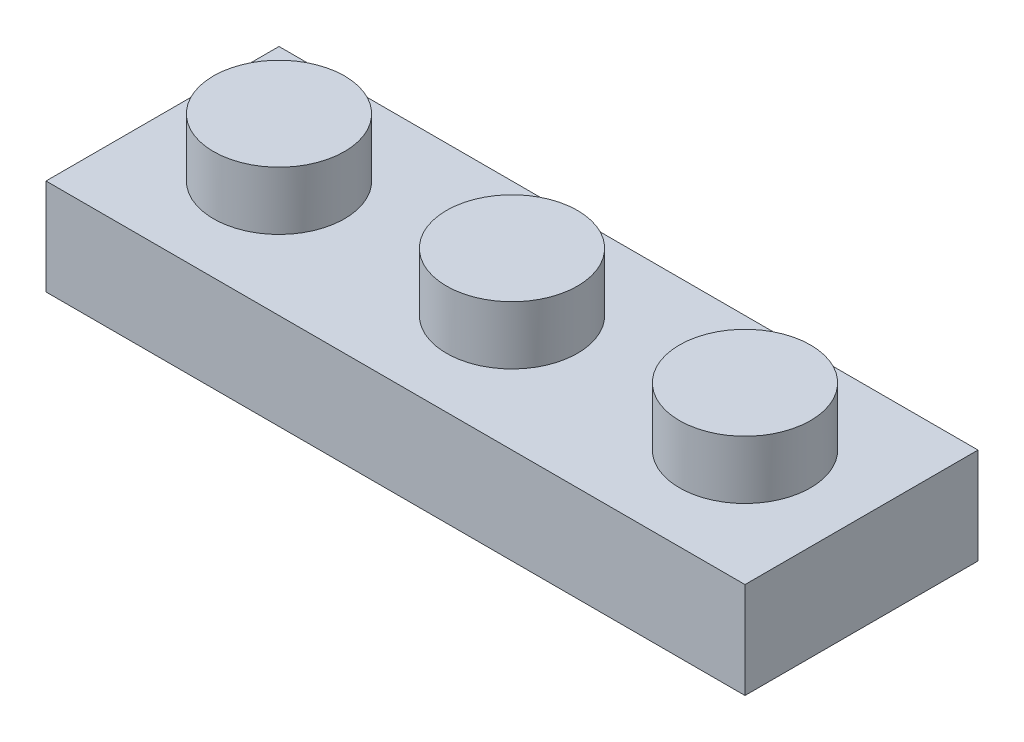
ISO-10303-21;
HEADER;
FILE_DESCRIPTION(('STEP AP214'),'2;1');
FILE_NAME('part.step','',(''),(''),'','','');
FILE_SCHEMA(('AUTOMOTIVE_DESIGN { 1 0 10303 214 1 1 1 1 }'));
ENDSEC;
DATA;
#1=APPLICATION_CONTEXT('core data for automotive mechanical design processes');
#2=APPLICATION_PROTOCOL_DEFINITION('international standard','automotive_design',2000,#1);
#3=PRODUCT_CONTEXT('',#1,'mechanical');
#4=PRODUCT('Part','Part','',(#3));
#5=PRODUCT_RELATED_PRODUCT_CATEGORY('part','',(#4));
#6=PRODUCT_DEFINITION_FORMATION('','',#4);
#7=PRODUCT_DEFINITION_CONTEXT('part definition',#1,'design');
#8=PRODUCT_DEFINITION('design','',#6,#7);
#9=PRODUCT_DEFINITION_SHAPE('','',#8);
#10=(LENGTH_UNIT() NAMED_UNIT(*) SI_UNIT(.MILLI.,.METRE.));
#11=(NAMED_UNIT(*) PLANE_ANGLE_UNIT() SI_UNIT($,.RADIAN.));
#12=(NAMED_UNIT(*) SI_UNIT($,.STERADIAN.) SOLID_ANGLE_UNIT());
#13=UNCERTAINTY_MEASURE_WITH_UNIT(LENGTH_MEASURE(1.E-05),#10,'distance_accuracy_value','');
#14=(GEOMETRIC_REPRESENTATION_CONTEXT(3) GLOBAL_UNCERTAINTY_ASSIGNED_CONTEXT((#13)) GLOBAL_UNIT_ASSIGNED_CONTEXT((#10,
#11,#12)) REPRESENTATION_CONTEXT('',''));
#15=CARTESIAN_POINT('',(0.,0.,0.));
#16=DIRECTION('',(0.,0.,1.));
#17=DIRECTION('',(1.,0.,0.));
#18=AXIS2_PLACEMENT_3D('',#15,#16,#17);
#19=CARTESIAN_POINT('',(0.,3.3,-8.));
#20=DIRECTION('',(0.,-1.,0.));
#21=DIRECTION('',(0.,0.,-1.));
#22=AXIS2_PLACEMENT_3D('',#19,#20,#21);
#23=PLANE('',#22);
#24=CARTESIAN_POINT('',(12.,3.3,-4.));
#25=DIRECTION('',(0.,-1.,0.));
#26=DIRECTION('',(0.,0.,-1.));
#27=AXIS2_PLACEMENT_3D('',#24,#25,#26);
#28=CIRCLE('',#27,2.25);
#29=CARTESIAN_POINT('',(12.,3.3,-6.25));
#30=VERTEX_POINT('',#29);
#31=EDGE_CURVE('E44',#30,#30,#28,.F.);
#32=ORIENTED_EDGE('',*,*,#31,.F.);
#33=EDGE_LOOP('',(#32));
#34=FACE_BOUND('',#33,.T.);
#35=DIRECTION('',(0.,0.,1.));
#36=VECTOR('',#35,1.);
#37=CARTESIAN_POINT('',(0.,3.3,0.));
#38=LINE('',#37,#36);
#39=CARTESIAN_POINT('',(0.,3.3,-8.));
#40=VERTEX_POINT('',#39);
#41=CARTESIAN_POINT('',(0.,3.3,0.));
#42=VERTEX_POINT('',#41);
#43=EDGE_CURVE('E254',#40,#42,#38,.T.);
#44=ORIENTED_EDGE('',*,*,#43,.T.);
#45=DIRECTION('',(1.,0.,0.));
#46=VECTOR('',#45,1.);
#47=CARTESIAN_POINT('',(0.,3.3,0.));
#48=LINE('',#47,#46);
#49=CARTESIAN_POINT('',(24.,3.3,0.));
#50=VERTEX_POINT('',#49);
#51=EDGE_CURVE('E257',#42,#50,#48,.T.);
#52=ORIENTED_EDGE('',*,*,#51,.T.);
#53=DIRECTION('',(0.,0.,-1.));
#54=VECTOR('',#53,1.);
#55=CARTESIAN_POINT('',(24.,3.3,0.));
#56=LINE('',#55,#54);
#57=CARTESIAN_POINT('',(24.,3.3,-8.));
#58=VERTEX_POINT('',#57);
#59=EDGE_CURVE('E260',#50,#58,#56,.T.);
#60=ORIENTED_EDGE('',*,*,#59,.T.);
#61=DIRECTION('',(-1.,0.,0.));
#62=VECTOR('',#61,1.);
#63=CARTESIAN_POINT('',(0.,3.3,-8.));
#64=LINE('',#63,#62);
#65=EDGE_CURVE('E262',#58,#40,#64,.T.);
#66=ORIENTED_EDGE('',*,*,#65,.T.);
#67=EDGE_LOOP('',(#44,#52,#60,#66));
#68=FACE_BOUND('',#67,.T.);
#69=CARTESIAN_POINT('',(4.,3.3,-4.));
#70=DIRECTION('',(0.,-1.,0.));
#71=DIRECTION('',(0.,0.,-1.));
#72=AXIS2_PLACEMENT_3D('',#69,#70,#71);
#73=CIRCLE('',#72,2.25);
#74=CARTESIAN_POINT('',(4.,3.3,-6.25));
#75=VERTEX_POINT('',#74);
#76=EDGE_CURVE('E283',#75,#75,#73,.F.);
#77=ORIENTED_EDGE('',*,*,#76,.F.);
#78=EDGE_LOOP('',(#77));
#79=FACE_BOUND('',#78,.T.);
#80=CARTESIAN_POINT('',(20.,3.3,-4.));
#81=DIRECTION('',(0.,-1.,0.));
#82=DIRECTION('',(0.,0.,-1.));
#83=AXIS2_PLACEMENT_3D('',#80,#81,#82);
#84=CIRCLE('',#83,2.25);
#85=CARTESIAN_POINT('',(20.,3.3,-6.25));
#86=VERTEX_POINT('',#85);
#87=EDGE_CURVE('E11',#86,#86,#84,.F.);
#88=ORIENTED_EDGE('',*,*,#87,.F.);
#89=EDGE_LOOP('',(#88));
#90=FACE_BOUND('',#89,.T.);
#91=ADVANCED_FACE('F36',(#34,#68,#79,#90),#23,.F.);
#92=CARTESIAN_POINT('',(0.,3.3,0.));
#93=DIRECTION('',(1.,0.,0.));
#94=DIRECTION('',(0.,0.,-1.));
#95=AXIS2_PLACEMENT_3D('',#92,#93,#94);
#96=PLANE('',#95);
#97=DIRECTION('',(0.,0.,1.));
#98=VECTOR('',#97,1.);
#99=CARTESIAN_POINT('',(0.,0.,0.));
#100=LINE('',#99,#98);
#101=CARTESIAN_POINT('',(0.,0.,-8.));
#102=VERTEX_POINT('',#101);
#103=CARTESIAN_POINT('',(0.,0.,0.));
#104=VERTEX_POINT('',#103);
#105=EDGE_CURVE('E253',#102,#104,#100,.T.);
#106=ORIENTED_EDGE('',*,*,#105,.T.);
#107=DIRECTION('',(0.,-1.,0.));
#108=VECTOR('',#107,1.);
#109=CARTESIAN_POINT('',(0.,3.3,0.));
#110=LINE('',#109,#108);
#111=EDGE_CURVE('E280',#42,#104,#110,.T.);
#112=ORIENTED_EDGE('',*,*,#111,.F.);
#113=ORIENTED_EDGE('',*,*,#43,.F.);
#114=DIRECTION('',(0.,-1.,0.));
#115=VECTOR('',#114,1.);
#116=CARTESIAN_POINT('',(0.,3.3,-8.));
#117=LINE('',#116,#115);
#118=EDGE_CURVE('E264',#40,#102,#117,.T.);
#119=ORIENTED_EDGE('',*,*,#118,.T.);
#120=EDGE_LOOP('',(#106,#112,#113,#119));
#121=FACE_BOUND('',#120,.T.);
#122=ADVANCED_FACE('F38',(#121),#96,.F.);
#123=CARTESIAN_POINT('',(0.,3.3,0.));
#124=DIRECTION('',(0.,0.,-1.));
#125=DIRECTION('',(-1.,0.,0.));
#126=AXIS2_PLACEMENT_3D('',#123,#124,#125);
#127=PLANE('',#126);
#128=DIRECTION('',(1.,0.,0.));
#129=VECTOR('',#128,1.);
#130=CARTESIAN_POINT('',(0.,0.,0.));
#131=LINE('',#130,#129);
#132=CARTESIAN_POINT('',(24.,0.,0.));
#133=VERTEX_POINT('',#132);
#134=EDGE_CURVE('E267',#104,#133,#131,.T.);
#135=ORIENTED_EDGE('',*,*,#134,.T.);
#136=DIRECTION('',(0.,-1.,0.));
#137=VECTOR('',#136,1.);
#138=CARTESIAN_POINT('',(24.,3.3,0.));
#139=LINE('',#138,#137);
#140=EDGE_CURVE('E277',#50,#133,#139,.T.);
#141=ORIENTED_EDGE('',*,*,#140,.F.);
#142=ORIENTED_EDGE('',*,*,#51,.F.);
#143=ORIENTED_EDGE('',*,*,#111,.T.);
#144=EDGE_LOOP('',(#135,#141,#142,#143));
#145=FACE_BOUND('',#144,.T.);
#146=ADVANCED_FACE('F389',(#145),#127,.F.);
#147=CARTESIAN_POINT('',(24.,3.3,0.));
#148=DIRECTION('',(-1.,0.,0.));
#149=DIRECTION('',(0.,0.,1.));
#150=AXIS2_PLACEMENT_3D('',#147,#148,#149);
#151=PLANE('',#150);
#152=DIRECTION('',(0.,0.,-1.));
#153=VECTOR('',#152,1.);
#154=CARTESIAN_POINT('',(24.,0.,0.));
#155=LINE('',#154,#153);
#156=CARTESIAN_POINT('',(24.,0.,-8.));
#157=VERTEX_POINT('',#156);
#158=EDGE_CURVE('E269',#133,#157,#155,.T.);
#159=ORIENTED_EDGE('',*,*,#158,.T.);
#160=DIRECTION('',(0.,-1.,0.));
#161=VECTOR('',#160,1.);
#162=CARTESIAN_POINT('',(24.,3.3,-8.));
#163=LINE('',#162,#161);
#164=EDGE_CURVE('E274',#58,#157,#163,.T.);
#165=ORIENTED_EDGE('',*,*,#164,.F.);
#166=ORIENTED_EDGE('',*,*,#59,.F.);
#167=ORIENTED_EDGE('',*,*,#140,.T.);
#168=EDGE_LOOP('',(#159,#165,#166,#167));
#169=FACE_BOUND('',#168,.T.);
#170=ADVANCED_FACE('F386',(#169),#151,.F.);
#171=CARTESIAN_POINT('',(0.,3.3,-8.));
#172=DIRECTION('',(0.,0.,1.));
#173=DIRECTION('',(1.,0.,0.));
#174=AXIS2_PLACEMENT_3D('',#171,#172,#173);
#175=PLANE('',#174);
#176=DIRECTION('',(-1.,0.,0.));
#177=VECTOR('',#176,1.);
#178=CARTESIAN_POINT('',(0.,0.,-8.));
#179=LINE('',#178,#177);
#180=EDGE_CURVE('E258',#157,#102,#179,.T.);
#181=ORIENTED_EDGE('',*,*,#180,.T.);
#182=ORIENTED_EDGE('',*,*,#118,.F.);
#183=ORIENTED_EDGE('',*,*,#65,.F.);
#184=ORIENTED_EDGE('',*,*,#164,.T.);
#185=EDGE_LOOP('',(#181,#182,#183,#184));
#186=FACE_BOUND('',#185,.T.);
#187=ADVANCED_FACE('F367',(#186),#175,.F.);
#188=CARTESIAN_POINT('',(0.,0.,-8.));
#189=DIRECTION('',(0.,-1.,0.));
#190=DIRECTION('',(0.,0.,-1.));
#191=AXIS2_PLACEMENT_3D('',#188,#189,#190);
#192=PLANE('',#191);
#193=DIRECTION('',(0.,0.,-1.));
#194=VECTOR('',#193,1.);
#195=CARTESIAN_POINT('',(1.75,0.,-1.75));
#196=LINE('',#195,#194);
#197=CARTESIAN_POINT('',(1.75,0.,-1.75));
#198=VERTEX_POINT('',#197);
#199=CARTESIAN_POINT('',(1.74999999999999,0.,-6.25));
#200=VERTEX_POINT('',#199);
#201=EDGE_CURVE('E51',#198,#200,#196,.T.);
#202=ORIENTED_EDGE('',*,*,#201,.F.);
#203=DIRECTION('',(-1.,0.,0.));
#204=VECTOR('',#203,1.);
#205=CARTESIAN_POINT('',(1.75,0.,-1.75));
#206=LINE('',#205,#204);
#207=CARTESIAN_POINT('',(6.25,0.,-1.75));
#208=VERTEX_POINT('',#207);
#209=EDGE_CURVE('E181',#208,#198,#206,.T.);
#210=ORIENTED_EDGE('',*,*,#209,.F.);
#211=DIRECTION('',(0.,0.,1.));
#212=VECTOR('',#211,1.);
#213=CARTESIAN_POINT('',(6.25,0.,-1.75));
#214=LINE('',#213,#212);
#215=CARTESIAN_POINT('',(6.25,0.,-6.25));
#216=VERTEX_POINT('',#215);
#217=EDGE_CURVE('E172',#216,#208,#214,.T.);
#218=ORIENTED_EDGE('',*,*,#217,.F.);
#219=DIRECTION('',(1.,0.,0.));
#220=VECTOR('',#219,1.);
#221=CARTESIAN_POINT('',(1.74999999999999,0.,-6.25));
#222=LINE('',#221,#220);
#223=EDGE_CURVE('E160',#200,#216,#222,.T.);
#224=ORIENTED_EDGE('',*,*,#223,.F.);
#225=EDGE_LOOP('',(#202,#210,#218,#224));
#226=FACE_BOUND('',#225,.T.);
#227=DIRECTION('',(0.,0.,-1.));
#228=VECTOR('',#227,1.);
#229=CARTESIAN_POINT('',(9.75,0.,-1.75));
#230=LINE('',#229,#228);
#231=CARTESIAN_POINT('',(9.75,0.,-1.75));
#232=VERTEX_POINT('',#231);
#233=CARTESIAN_POINT('',(9.74999999999999,0.,-6.25));
#234=VERTEX_POINT('',#233);
#235=EDGE_CURVE('E59',#232,#234,#230,.T.);
#236=ORIENTED_EDGE('',*,*,#235,.F.);
#237=DIRECTION('',(-1.,0.,0.));
#238=VECTOR('',#237,1.);
#239=CARTESIAN_POINT('',(9.75,0.,-1.75));
#240=LINE('',#239,#238);
#241=CARTESIAN_POINT('',(14.25,0.,-1.75));
#242=VERTEX_POINT('',#241);
#243=EDGE_CURVE('E207',#242,#232,#240,.T.);
#244=ORIENTED_EDGE('',*,*,#243,.F.);
#245=DIRECTION('',(0.,0.,1.));
#246=VECTOR('',#245,1.);
#247=CARTESIAN_POINT('',(14.25,0.,-1.75));
#248=LINE('',#247,#246);
#249=CARTESIAN_POINT('',(14.25,0.,-6.25));
#250=VERTEX_POINT('',#249);
#251=EDGE_CURVE('E202',#250,#242,#248,.T.);
#252=ORIENTED_EDGE('',*,*,#251,.F.);
#253=DIRECTION('',(1.,0.,0.));
#254=VECTOR('',#253,1.);
#255=CARTESIAN_POINT('',(9.74999999999999,0.,-6.25));
#256=LINE('',#255,#254);
#257=EDGE_CURVE('E186',#234,#250,#256,.T.);
#258=ORIENTED_EDGE('',*,*,#257,.F.);
#259=EDGE_LOOP('',(#236,#244,#252,#258));
#260=FACE_BOUND('',#259,.T.);
#261=DIRECTION('',(0.,0.,-1.));
#262=VECTOR('',#261,1.);
#263=CARTESIAN_POINT('',(17.75,0.,-1.75));
#264=LINE('',#263,#262);
#265=CARTESIAN_POINT('',(17.75,0.,-1.75));
#266=VERTEX_POINT('',#265);
#267=CARTESIAN_POINT('',(17.75,0.,-6.25));
#268=VERTEX_POINT('',#267);
#269=EDGE_CURVE('E218',#266,#268,#264,.T.);
#270=ORIENTED_EDGE('',*,*,#269,.F.);
#271=DIRECTION('',(-1.,0.,0.));
#272=VECTOR('',#271,1.);
#273=CARTESIAN_POINT('',(17.75,0.,-1.75));
#274=LINE('',#273,#272);
#275=CARTESIAN_POINT('',(22.25,0.,-1.75));
#276=VERTEX_POINT('',#275);
#277=EDGE_CURVE('E223',#276,#266,#274,.T.);
#278=ORIENTED_EDGE('',*,*,#277,.F.);
#279=DIRECTION('',(0.,0.,1.));
#280=VECTOR('',#279,1.);
#281=CARTESIAN_POINT('',(22.25,0.,-1.75));
#282=LINE('',#281,#280);
#283=CARTESIAN_POINT('',(22.25,0.,-6.25));
#284=VERTEX_POINT('',#283);
#285=EDGE_CURVE('E237',#284,#276,#282,.T.);
#286=ORIENTED_EDGE('',*,*,#285,.F.);
#287=DIRECTION('',(1.,0.,0.));
#288=VECTOR('',#287,1.);
#289=CARTESIAN_POINT('',(17.75,0.,-6.25));
#290=LINE('',#289,#288);
#291=EDGE_CURVE('E234',#268,#284,#290,.T.);
#292=ORIENTED_EDGE('',*,*,#291,.F.);
#293=EDGE_LOOP('',(#270,#278,#286,#292));
#294=FACE_BOUND('',#293,.T.);
#295=ORIENTED_EDGE('',*,*,#105,.F.);
#296=ORIENTED_EDGE('',*,*,#180,.F.);
#297=ORIENTED_EDGE('',*,*,#158,.F.);
#298=ORIENTED_EDGE('',*,*,#134,.F.);
#299=EDGE_LOOP('',(#295,#296,#297,#298));
#300=FACE_BOUND('',#299,.T.);
#301=ADVANCED_FACE('F361',(#226,#260,#294,#300),#192,.T.);
#302=CARTESIAN_POINT('',(4.,5.3,-4.));
#303=DIRECTION('',(0.,-1.,0.));
#304=DIRECTION('',(0.,0.,-1.));
#305=AXIS2_PLACEMENT_3D('',#302,#303,#304);
#306=CYLINDRICAL_SURFACE('',#305,2.25);
#307=CARTESIAN_POINT('',(4.,5.3,-4.));
#308=DIRECTION('',(0.,1.,0.));
#309=DIRECTION('',(0.,0.,1.));
#310=AXIS2_PLACEMENT_3D('',#307,#308,#309);
#311=CIRCLE('',#310,2.25);
#312=CARTESIAN_POINT('',(4.,5.3,-1.75));
#313=VERTEX_POINT('',#312);
#314=EDGE_CURVE('E244',#313,#313,#311,.T.);
#315=ORIENTED_EDGE('',*,*,#314,.F.);
#316=EDGE_LOOP('',(#315));
#317=FACE_BOUND('',#316,.T.);
#318=ORIENTED_EDGE('',*,*,#76,.T.);
#319=EDGE_LOOP('',(#318));
#320=FACE_BOUND('',#319,.T.);
#321=ADVANCED_FACE('F366',(#317,#320),#306,.T.);
#322=CARTESIAN_POINT('',(4.,5.3,-4.));
#323=DIRECTION('',(0.,1.,0.));
#324=DIRECTION('',(0.,0.,1.));
#325=AXIS2_PLACEMENT_3D('',#322,#323,#324);
#326=PLANE('',#325);
#327=ORIENTED_EDGE('',*,*,#314,.T.);
#328=EDGE_LOOP('',(#327));
#329=FACE_BOUND('',#328,.T.);
#330=ADVANCED_FACE('F401',(#329),#326,.T.);
#331=CARTESIAN_POINT('',(17.75,2.5,-1.75));
#332=DIRECTION('',(-1.,0.,0.));
#333=DIRECTION('',(0.,0.,1.));
#334=AXIS2_PLACEMENT_3D('',#331,#332,#333);
#335=PLANE('',#334);
#336=ORIENTED_EDGE('',*,*,#269,.T.);
#337=DIRECTION('',(0.,-1.,0.));
#338=VECTOR('',#337,1.);
#339=CARTESIAN_POINT('',(17.75,2.5,-6.25));
#340=LINE('',#339,#338);
#341=CARTESIAN_POINT('',(17.75,2.5,-6.25));
#342=VERTEX_POINT('',#341);
#343=EDGE_CURVE('E232',#342,#268,#340,.T.);
#344=ORIENTED_EDGE('',*,*,#343,.F.);
#345=DIRECTION('',(0.,0.,-1.));
#346=VECTOR('',#345,1.);
#347=CARTESIAN_POINT('',(17.75,2.5,-1.75));
#348=LINE('',#347,#346);
#349=CARTESIAN_POINT('',(17.75,2.5,-1.75));
#350=VERTEX_POINT('',#349);
#351=EDGE_CURVE('E219',#350,#342,#348,.T.);
#352=ORIENTED_EDGE('',*,*,#351,.F.);
#353=DIRECTION('',(0.,-1.,0.));
#354=VECTOR('',#353,1.);
#355=CARTESIAN_POINT('',(17.75,2.5,-1.75));
#356=LINE('',#355,#354);
#357=EDGE_CURVE('E242',#350,#266,#356,.T.);
#358=ORIENTED_EDGE('',*,*,#357,.T.);
#359=EDGE_LOOP('',(#336,#344,#352,#358));
#360=FACE_BOUND('',#359,.T.);
#361=ADVANCED_FACE('F405',(#360),#335,.F.);
#362=CARTESIAN_POINT('',(17.75,2.5,-1.75));
#363=DIRECTION('',(0.,0.,1.));
#364=DIRECTION('',(1.,0.,0.));
#365=AXIS2_PLACEMENT_3D('',#362,#363,#364);
#366=PLANE('',#365);
#367=ORIENTED_EDGE('',*,*,#277,.T.);
#368=ORIENTED_EDGE('',*,*,#357,.F.);
#369=DIRECTION('',(-1.,0.,0.));
#370=VECTOR('',#369,1.);
#371=CARTESIAN_POINT('',(17.75,2.5,-1.75));
#372=LINE('',#371,#370);
#373=CARTESIAN_POINT('',(22.25,2.5,-1.75));
#374=VERTEX_POINT('',#373);
#375=EDGE_CURVE('E229',#374,#350,#372,.T.);
#376=ORIENTED_EDGE('',*,*,#375,.F.);
#377=DIRECTION('',(0.,-1.,0.));
#378=VECTOR('',#377,1.);
#379=CARTESIAN_POINT('',(22.25,2.5,-1.75));
#380=LINE('',#379,#378);
#381=EDGE_CURVE('E245',#374,#276,#380,.T.);
#382=ORIENTED_EDGE('',*,*,#381,.T.);
#383=EDGE_LOOP('',(#367,#368,#376,#382));
#384=FACE_BOUND('',#383,.T.);
#385=ADVANCED_FACE('F409',(#384),#366,.F.);
#386=CARTESIAN_POINT('',(22.25,2.5,-1.75));
#387=DIRECTION('',(1.,0.,0.));
#388=DIRECTION('',(0.,0.,-1.));
#389=AXIS2_PLACEMENT_3D('',#386,#387,#388);
#390=PLANE('',#389);
#391=ORIENTED_EDGE('',*,*,#285,.T.);
#392=ORIENTED_EDGE('',*,*,#381,.F.);
#393=DIRECTION('',(0.,0.,1.));
#394=VECTOR('',#393,1.);
#395=CARTESIAN_POINT('',(22.25,2.5,-1.75));
#396=LINE('',#395,#394);
#397=CARTESIAN_POINT('',(22.25,2.5,-6.25));
#398=VERTEX_POINT('',#397);
#399=EDGE_CURVE('E226',#398,#374,#396,.T.);
#400=ORIENTED_EDGE('',*,*,#399,.F.);
#401=DIRECTION('',(0.,-1.,0.));
#402=VECTOR('',#401,1.);
#403=CARTESIAN_POINT('',(22.25,2.5,-6.25));
#404=LINE('',#403,#402);
#405=EDGE_CURVE('E247',#398,#284,#404,.T.);
#406=ORIENTED_EDGE('',*,*,#405,.T.);
#407=EDGE_LOOP('',(#391,#392,#400,#406));
#408=FACE_BOUND('',#407,.T.);
#409=ADVANCED_FACE('F414',(#408),#390,.F.);
#410=CARTESIAN_POINT('',(17.75,2.5,-6.25));
#411=DIRECTION('',(0.,0.,-1.));
#412=DIRECTION('',(-1.,0.,0.));
#413=AXIS2_PLACEMENT_3D('',#410,#411,#412);
#414=PLANE('',#413);
#415=ORIENTED_EDGE('',*,*,#291,.T.);
#416=ORIENTED_EDGE('',*,*,#405,.F.);
#417=DIRECTION('',(1.,0.,0.));
#418=VECTOR('',#417,1.);
#419=CARTESIAN_POINT('',(17.75,2.5,-6.25));
#420=LINE('',#419,#418);
#421=EDGE_CURVE('E222',#342,#398,#420,.T.);
#422=ORIENTED_EDGE('',*,*,#421,.F.);
#423=ORIENTED_EDGE('',*,*,#343,.T.);
#424=EDGE_LOOP('',(#415,#416,#422,#423));
#425=FACE_BOUND('',#424,.T.);
#426=ADVANCED_FACE('F411',(#425),#414,.F.);
#427=CARTESIAN_POINT('',(17.75,2.5,-6.25));
#428=DIRECTION('',(0.,-1.,0.));
#429=DIRECTION('',(0.,0.,-1.));
#430=AXIS2_PLACEMENT_3D('',#427,#428,#429);
#431=PLANE('',#430);
#432=ORIENTED_EDGE('',*,*,#351,.T.);
#433=ORIENTED_EDGE('',*,*,#421,.T.);
#434=ORIENTED_EDGE('',*,*,#399,.T.);
#435=ORIENTED_EDGE('',*,*,#375,.T.);
#436=EDGE_LOOP('',(#432,#433,#434,#435));
#437=FACE_BOUND('',#436,.T.);
#438=ADVANCED_FACE('F316',(#437),#431,.T.);
#439=CARTESIAN_POINT('',(12.,5.3,-4.));
#440=DIRECTION('',(0.,-1.,0.));
#441=DIRECTION('',(0.,0.,-1.));
#442=AXIS2_PLACEMENT_3D('',#439,#440,#441);
#443=CYLINDRICAL_SURFACE('',#442,2.25);
#444=CARTESIAN_POINT('',(12.,5.3,-4.));
#445=DIRECTION('',(0.,1.,0.));
#446=DIRECTION('',(0.,0.,1.));
#447=AXIS2_PLACEMENT_3D('',#444,#445,#446);
#448=CIRCLE('',#447,2.25);
#449=CARTESIAN_POINT('',(12.,5.3,-1.75));
#450=VERTEX_POINT('',#449);
#451=EDGE_CURVE('E215',#450,#450,#448,.T.);
#452=ORIENTED_EDGE('',*,*,#451,.F.);
#453=EDGE_LOOP('',(#452));
#454=FACE_BOUND('',#453,.T.);
#455=ORIENTED_EDGE('',*,*,#31,.T.);
#456=EDGE_LOOP('',(#455));
#457=FACE_BOUND('',#456,.T.);
#458=ADVANCED_FACE('F288',(#454,#457),#443,.T.);
#459=CARTESIAN_POINT('',(12.,5.3,-4.));
#460=DIRECTION('',(0.,1.,0.));
#461=DIRECTION('',(0.,0.,1.));
#462=AXIS2_PLACEMENT_3D('',#459,#460,#461);
#463=PLANE('',#462);
#464=ORIENTED_EDGE('',*,*,#451,.T.);
#465=EDGE_LOOP('',(#464));
#466=FACE_BOUND('',#465,.T.);
#467=ADVANCED_FACE('F303',(#466),#463,.T.);
#468=CARTESIAN_POINT('',(20.,5.3,-4.));
#469=DIRECTION('',(0.,-1.,0.));
#470=DIRECTION('',(0.,0.,-1.));
#471=AXIS2_PLACEMENT_3D('',#468,#469,#470);
#472=CYLINDRICAL_SURFACE('',#471,2.25);
#473=CARTESIAN_POINT('',(20.,5.3,-4.));
#474=DIRECTION('',(0.,1.,0.));
#475=DIRECTION('',(0.,0.,1.));
#476=AXIS2_PLACEMENT_3D('',#473,#474,#475);
#477=CIRCLE('',#476,2.25);
#478=CARTESIAN_POINT('',(20.,5.3,-1.75));
#479=VERTEX_POINT('',#478);
#480=EDGE_CURVE('E212',#479,#479,#477,.T.);
#481=ORIENTED_EDGE('',*,*,#480,.F.);
#482=EDGE_LOOP('',(#481));
#483=FACE_BOUND('',#482,.T.);
#484=ORIENTED_EDGE('',*,*,#87,.T.);
#485=EDGE_LOOP('',(#484));
#486=FACE_BOUND('',#485,.T.);
#487=ADVANCED_FACE('F300',(#483,#486),#472,.T.);
#488=CARTESIAN_POINT('',(20.,5.3,-4.));
#489=DIRECTION('',(0.,1.,0.));
#490=DIRECTION('',(0.,0.,1.));
#491=AXIS2_PLACEMENT_3D('',#488,#489,#490);
#492=PLANE('',#491);
#493=ORIENTED_EDGE('',*,*,#480,.T.);
#494=EDGE_LOOP('',(#493));
#495=FACE_BOUND('',#494,.T.);
#496=ADVANCED_FACE('F302',(#495),#492,.T.);
#497=CARTESIAN_POINT('',(9.75,2.5,-1.75));
#498=DIRECTION('',(-1.,0.,0.));
#499=DIRECTION('',(0.,0.,1.));
#500=AXIS2_PLACEMENT_3D('',#497,#498,#499);
#501=PLANE('',#500);
#502=ORIENTED_EDGE('',*,*,#235,.T.);
#503=DIRECTION('',(0.,-1.,0.));
#504=VECTOR('',#503,1.);
#505=CARTESIAN_POINT('',(9.74999999999999,2.5,-6.25));
#506=LINE('',#505,#504);
#507=CARTESIAN_POINT('',(9.74999999999999,2.5,-6.25));
#508=VERTEX_POINT('',#507);
#509=EDGE_CURVE('E200',#508,#234,#506,.T.);
#510=ORIENTED_EDGE('',*,*,#509,.F.);
#511=DIRECTION('',(0.,0.,-1.));
#512=VECTOR('',#511,1.);
#513=CARTESIAN_POINT('',(9.75,2.5,-1.75));
#514=LINE('',#513,#512);
#515=CARTESIAN_POINT('',(9.75,2.5,-1.75));
#516=VERTEX_POINT('',#515);
#517=EDGE_CURVE('E188',#516,#508,#514,.T.);
#518=ORIENTED_EDGE('',*,*,#517,.F.);
#519=DIRECTION('',(0.,-1.,0.));
#520=VECTOR('',#519,1.);
#521=CARTESIAN_POINT('',(9.75,2.5,-1.75));
#522=LINE('',#521,#520);
#523=EDGE_CURVE('E209',#516,#232,#522,.T.);
#524=ORIENTED_EDGE('',*,*,#523,.T.);
#525=EDGE_LOOP('',(#502,#510,#518,#524));
#526=FACE_BOUND('',#525,.T.);
#527=ADVANCED_FACE('F311',(#526),#501,.F.);
#528=CARTESIAN_POINT('',(9.75,2.5,-1.75));
#529=DIRECTION('',(0.,0.,1.));
#530=DIRECTION('',(1.,0.,0.));
#531=AXIS2_PLACEMENT_3D('',#528,#529,#530);
#532=PLANE('',#531);
#533=ORIENTED_EDGE('',*,*,#243,.T.);
#534=ORIENTED_EDGE('',*,*,#523,.F.);
#535=DIRECTION('',(-1.,0.,0.));
#536=VECTOR('',#535,1.);
#537=CARTESIAN_POINT('',(9.75,2.5,-1.75));
#538=LINE('',#537,#536);
#539=CARTESIAN_POINT('',(14.25,2.5,-1.75));
#540=VERTEX_POINT('',#539);
#541=EDGE_CURVE('E194',#540,#516,#538,.T.);
#542=ORIENTED_EDGE('',*,*,#541,.F.);
#543=DIRECTION('',(0.,-1.,0.));
#544=VECTOR('',#543,1.);
#545=CARTESIAN_POINT('',(14.25,2.5,-1.75));
#546=LINE('',#545,#544);
#547=EDGE_CURVE('E204',#540,#242,#546,.T.);
#548=ORIENTED_EDGE('',*,*,#547,.T.);
#549=EDGE_LOOP('',(#533,#534,#542,#548));
#550=FACE_BOUND('',#549,.T.);
#551=ADVANCED_FACE('F335',(#550),#532,.F.);
#552=CARTESIAN_POINT('',(14.25,2.5,-1.75));
#553=DIRECTION('',(1.,0.,0.));
#554=DIRECTION('',(0.,0.,-1.));
#555=AXIS2_PLACEMENT_3D('',#552,#553,#554);
#556=PLANE('',#555);
#557=ORIENTED_EDGE('',*,*,#251,.T.);
#558=ORIENTED_EDGE('',*,*,#547,.F.);
#559=DIRECTION('',(0.,0.,1.));
#560=VECTOR('',#559,1.);
#561=CARTESIAN_POINT('',(14.25,2.5,-1.75));
#562=LINE('',#561,#560);
#563=CARTESIAN_POINT('',(14.25,2.5,-6.25));
#564=VERTEX_POINT('',#563);
#565=EDGE_CURVE('E192',#564,#540,#562,.T.);
#566=ORIENTED_EDGE('',*,*,#565,.F.);
#567=DIRECTION('',(0.,-1.,0.));
#568=VECTOR('',#567,1.);
#569=CARTESIAN_POINT('',(14.25,2.5,-6.25));
#570=LINE('',#569,#568);
#571=EDGE_CURVE('E197',#564,#250,#570,.T.);
#572=ORIENTED_EDGE('',*,*,#571,.T.);
#573=EDGE_LOOP('',(#557,#558,#566,#572));
#574=FACE_BOUND('',#573,.T.);
#575=ADVANCED_FACE('F328',(#574),#556,.F.);
#576=CARTESIAN_POINT('',(9.74999999999999,2.5,-6.25));
#577=DIRECTION('',(0.,0.,-1.));
#578=DIRECTION('',(-1.,0.,0.));
#579=AXIS2_PLACEMENT_3D('',#576,#577,#578);
#580=PLANE('',#579);
#581=ORIENTED_EDGE('',*,*,#257,.T.);
#582=ORIENTED_EDGE('',*,*,#571,.F.);
#583=DIRECTION('',(1.,0.,0.));
#584=VECTOR('',#583,1.);
#585=CARTESIAN_POINT('',(9.74999999999999,2.5,-6.25));
#586=LINE('',#585,#584);
#587=EDGE_CURVE('E190',#508,#564,#586,.T.);
#588=ORIENTED_EDGE('',*,*,#587,.F.);
#589=ORIENTED_EDGE('',*,*,#509,.T.);
#590=EDGE_LOOP('',(#581,#582,#588,#589));
#591=FACE_BOUND('',#590,.T.);
#592=ADVANCED_FACE('F319',(#591),#580,.F.);
#593=CARTESIAN_POINT('',(9.74999999999999,2.5,-6.25));
#594=DIRECTION('',(0.,-1.,0.));
#595=DIRECTION('',(0.,0.,-1.));
#596=AXIS2_PLACEMENT_3D('',#593,#594,#595);
#597=PLANE('',#596);
#598=ORIENTED_EDGE('',*,*,#517,.T.);
#599=ORIENTED_EDGE('',*,*,#587,.T.);
#600=ORIENTED_EDGE('',*,*,#565,.T.);
#601=ORIENTED_EDGE('',*,*,#541,.T.);
#602=EDGE_LOOP('',(#598,#599,#600,#601));
#603=FACE_BOUND('',#602,.T.);
#604=ADVANCED_FACE('F306',(#603),#597,.T.);
#605=CARTESIAN_POINT('',(1.75,2.5,-1.75));
#606=DIRECTION('',(-1.,0.,0.));
#607=DIRECTION('',(0.,0.,1.));
#608=AXIS2_PLACEMENT_3D('',#605,#606,#607);
#609=PLANE('',#608);
#610=ORIENTED_EDGE('',*,*,#201,.T.);
#611=DIRECTION('',(0.,-1.,0.));
#612=VECTOR('',#611,1.);
#613=CARTESIAN_POINT('',(1.74999999999999,2.5,-6.25));
#614=LINE('',#613,#612);
#615=CARTESIAN_POINT('',(1.74999999999999,2.5,-6.25));
#616=VERTEX_POINT('',#615);
#617=EDGE_CURVE('E165',#616,#200,#614,.T.);
#618=ORIENTED_EDGE('',*,*,#617,.F.);
#619=DIRECTION('',(0.,0.,-1.));
#620=VECTOR('',#619,1.);
#621=CARTESIAN_POINT('',(1.75,2.5,-1.75));
#622=LINE('',#621,#620);
#623=CARTESIAN_POINT('',(1.75,2.5,-1.75));
#624=VERTEX_POINT('',#623);
#625=EDGE_CURVE('E152',#624,#616,#622,.T.);
#626=ORIENTED_EDGE('',*,*,#625,.F.);
#627=DIRECTION('',(0.,-1.,0.));
#628=VECTOR('',#627,1.);
#629=CARTESIAN_POINT('',(1.75,2.5,-1.75));
#630=LINE('',#629,#628);
#631=EDGE_CURVE('E183',#624,#198,#630,.T.);
#632=ORIENTED_EDGE('',*,*,#631,.T.);
#633=EDGE_LOOP('',(#610,#618,#626,#632));
#634=FACE_BOUND('',#633,.T.);
#635=ADVANCED_FACE('F171',(#634),#609,.F.);
#636=CARTESIAN_POINT('',(1.75,2.5,-1.75));
#637=DIRECTION('',(0.,0.,1.));
#638=DIRECTION('',(1.,0.,0.));
#639=AXIS2_PLACEMENT_3D('',#636,#637,#638);
#640=PLANE('',#639);
#641=ORIENTED_EDGE('',*,*,#209,.T.);
#642=ORIENTED_EDGE('',*,*,#631,.F.);
#643=DIRECTION('',(-1.,0.,0.));
#644=VECTOR('',#643,1.);
#645=CARTESIAN_POINT('',(1.75,2.5,-1.75));
#646=LINE('',#645,#644);
#647=CARTESIAN_POINT('',(6.25,2.5,-1.75));
#648=VERTEX_POINT('',#647);
#649=EDGE_CURVE('E158',#648,#624,#646,.T.);
#650=ORIENTED_EDGE('',*,*,#649,.F.);
#651=DIRECTION('',(0.,-1.,0.));
#652=VECTOR('',#651,1.);
#653=CARTESIAN_POINT('',(6.25,2.5,-1.75));
#654=LINE('',#653,#652);
#655=EDGE_CURVE('E174',#648,#208,#654,.T.);
#656=ORIENTED_EDGE('',*,*,#655,.T.);
#657=EDGE_LOOP('',(#641,#642,#650,#656));
#658=FACE_BOUND('',#657,.T.);
#659=ADVANCED_FACE('F326',(#658),#640,.F.);
#660=CARTESIAN_POINT('',(6.25,2.5,-1.75));
#661=DIRECTION('',(1.,0.,0.));
#662=DIRECTION('',(0.,0.,-1.));
#663=AXIS2_PLACEMENT_3D('',#660,#661,#662);
#664=PLANE('',#663);
#665=ORIENTED_EDGE('',*,*,#217,.T.);
#666=ORIENTED_EDGE('',*,*,#655,.F.);
#667=DIRECTION('',(0.,0.,1.));
#668=VECTOR('',#667,1.);
#669=CARTESIAN_POINT('',(6.25,2.5,-1.75));
#670=LINE('',#669,#668);
#671=CARTESIAN_POINT('',(6.25,2.5,-6.25));
#672=VERTEX_POINT('',#671);
#673=EDGE_CURVE('E169',#672,#648,#670,.T.);
#674=ORIENTED_EDGE('',*,*,#673,.F.);
#675=DIRECTION('',(0.,-1.,0.));
#676=VECTOR('',#675,1.);
#677=CARTESIAN_POINT('',(6.25,2.5,-6.25));
#678=LINE('',#677,#676);
#679=EDGE_CURVE('E168',#672,#216,#678,.T.);
#680=ORIENTED_EDGE('',*,*,#679,.T.);
#681=EDGE_LOOP('',(#665,#666,#674,#680));
#682=FACE_BOUND('',#681,.T.);
#683=ADVANCED_FACE('F348',(#682),#664,.F.);
#684=CARTESIAN_POINT('',(1.74999999999999,2.5,-6.25));
#685=DIRECTION('',(0.,0.,-1.));
#686=DIRECTION('',(-1.,0.,0.));
#687=AXIS2_PLACEMENT_3D('',#684,#685,#686);
#688=PLANE('',#687);
#689=ORIENTED_EDGE('',*,*,#223,.T.);
#690=ORIENTED_EDGE('',*,*,#679,.F.);
#691=DIRECTION('',(1.,0.,0.));
#692=VECTOR('',#691,1.);
#693=CARTESIAN_POINT('',(1.74999999999999,2.5,-6.25));
#694=LINE('',#693,#692);
#695=EDGE_CURVE('E155',#616,#672,#694,.T.);
#696=ORIENTED_EDGE('',*,*,#695,.F.);
#697=ORIENTED_EDGE('',*,*,#617,.T.);
#698=EDGE_LOOP('',(#689,#690,#696,#697));
#699=FACE_BOUND('',#698,.T.);
#700=ADVANCED_FACE('F164',(#699),#688,.F.);
#701=CARTESIAN_POINT('',(1.74999999999999,2.5,-6.25));
#702=DIRECTION('',(0.,-1.,0.));
#703=DIRECTION('',(0.,0.,-1.));
#704=AXIS2_PLACEMENT_3D('',#701,#702,#703);
#705=PLANE('',#704);
#706=ORIENTED_EDGE('',*,*,#625,.T.);
#707=ORIENTED_EDGE('',*,*,#695,.T.);
#708=ORIENTED_EDGE('',*,*,#673,.T.);
#709=ORIENTED_EDGE('',*,*,#649,.T.);
#710=EDGE_LOOP('',(#706,#707,#708,#709));
#711=FACE_BOUND('',#710,.T.);
#712=ADVANCED_FACE('F154',(#711),#705,.T.);
#713=CLOSED_SHELL('',(#91,#122,#146,#170,#187,#301,#321,#330,#361,#385,#409,#426,#438,#458,#467,
#487,#496,#527,#551,#575,#592,#604,#635,#659,#683,#700,#712));
#714=MANIFOLD_SOLID_BREP('B2',#713);
#715=ADVANCED_BREP_SHAPE_REPRESENTATION('',(#18,#714),#14);
#716=SHAPE_DEFINITION_REPRESENTATION(#9,#715);
ENDSEC;
END-ISO-10303-21;
